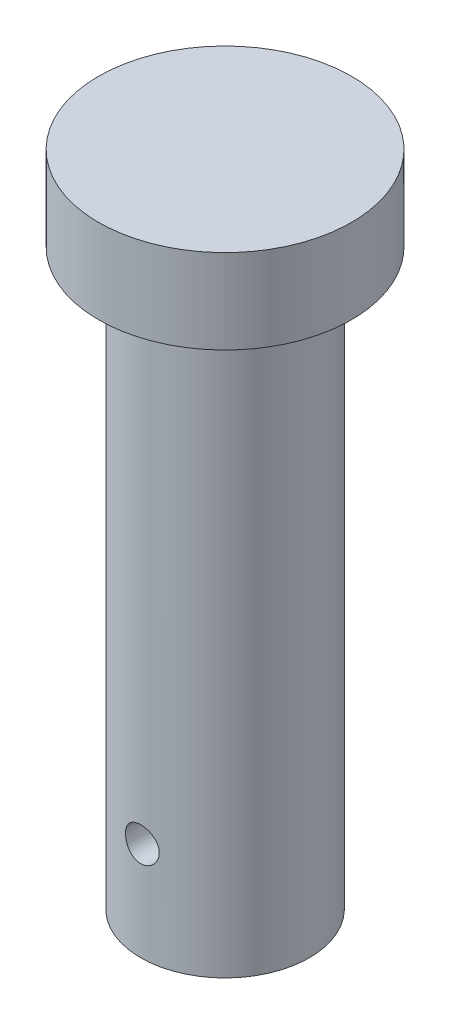
ISO-10303-21;
HEADER;
FILE_DESCRIPTION(('STEP AP214'),'2;1');
FILE_NAME('part.step','',(''),(''),'','','');
FILE_SCHEMA(('AUTOMOTIVE_DESIGN { 1 0 10303 214 1 1 1 1 }'));
ENDSEC;
DATA;
#1=APPLICATION_CONTEXT('core data for automotive mechanical design processes');
#2=APPLICATION_PROTOCOL_DEFINITION('international standard','automotive_design',2000,#1);
#3=PRODUCT_CONTEXT('',#1,'mechanical');
#4=PRODUCT('Part','Part','',(#3));
#5=PRODUCT_RELATED_PRODUCT_CATEGORY('part','',(#4));
#6=PRODUCT_DEFINITION_FORMATION('','',#4);
#7=PRODUCT_DEFINITION_CONTEXT('part definition',#1,'design');
#8=PRODUCT_DEFINITION('design','',#6,#7);
#9=PRODUCT_DEFINITION_SHAPE('','',#8);
#10=(LENGTH_UNIT() NAMED_UNIT(*) SI_UNIT(.MILLI.,.METRE.));
#11=(NAMED_UNIT(*) PLANE_ANGLE_UNIT() SI_UNIT($,.RADIAN.));
#12=(NAMED_UNIT(*) SI_UNIT($,.STERADIAN.) SOLID_ANGLE_UNIT());
#13=UNCERTAINTY_MEASURE_WITH_UNIT(LENGTH_MEASURE(1.E-05),#10,'distance_accuracy_value','');
#14=(GEOMETRIC_REPRESENTATION_CONTEXT(3) GLOBAL_UNCERTAINTY_ASSIGNED_CONTEXT((#13)) GLOBAL_UNIT_ASSIGNED_CONTEXT((#10,
#11,#12)) REPRESENTATION_CONTEXT('',''));
#15=CARTESIAN_POINT('',(0.,0.,0.));
#16=DIRECTION('',(0.,0.,1.));
#17=DIRECTION('',(1.,0.,0.));
#18=AXIS2_PLACEMENT_3D('',#15,#16,#17);
#19=CARTESIAN_POINT('',(0.,0.,0.));
#20=DIRECTION('',(0.,1.,0.));
#21=DIRECTION('',(-1.,0.,0.));
#22=AXIS2_PLACEMENT_3D('',#19,#20,#21);
#23=PLANE('',#22);
#24=CARTESIAN_POINT('',(0.,0.,0.));
#25=DIRECTION('',(0.,1.,0.));
#26=DIRECTION('',(-1.,0.,0.));
#27=AXIS2_PLACEMENT_3D('',#24,#25,#26);
#28=CIRCLE('',#27,15.);
#29=CARTESIAN_POINT('',(-15.,0.,0.));
#30=VERTEX_POINT('',#29);
#31=EDGE_CURVE('E10',#30,#30,#28,.T.);
#32=ORIENTED_EDGE('',*,*,#31,.F.);
#33=EDGE_LOOP('',(#32));
#34=FACE_BOUND('',#33,.T.);
#35=ADVANCED_FACE('F40',(#34),#23,.F.);
#36=CARTESIAN_POINT('',(0.,117.,0.));
#37=DIRECTION('',(0.,1.,0.));
#38=DIRECTION('',(-1.,0.,0.));
#39=AXIS2_PLACEMENT_3D('',#36,#37,#38);
#40=CYLINDRICAL_SURFACE('',#39,15.);
#41=CARTESIAN_POINT('',(3.,17.5,-14.6969384566991));
#42=CARTESIAN_POINT('',(2.99999383762581,17.6666931264735,-14.6969417707994));
#43=CARTESIAN_POINT('',(2.98605951515443,17.83346387,-14.6998052480611));
#44=CARTESIAN_POINT('',(2.93073685074852,18.1622875154294,-14.7109329391462));
#45=CARTESIAN_POINT('',(2.88932654121148,18.3243365339079,-14.7192014743436));
#46=CARTESIAN_POINT('',(2.78038734785924,18.6389119100626,-14.7401662116556));
#47=CARTESIAN_POINT('',(2.71288444245786,18.7914475645978,-14.7528580086323));
#48=CARTESIAN_POINT('',(2.55374732301151,19.0830245340909,-14.7812339844198));
#49=CARTESIAN_POINT('',(2.46211445580345,19.2220666016137,-14.7969179962038));
#50=CARTESIAN_POINT('',(2.25593722696031,19.4846830115616,-14.8297589908276));
#51=CARTESIAN_POINT('',(2.14111696773995,19.6080387636519,-14.8469321351174));
#52=CARTESIAN_POINT('',(1.89242036706393,19.8338726007369,-14.880674169078));
#53=CARTESIAN_POINT('',(1.75854269093395,19.9363492222516,-14.897243016325));
#54=CARTESIAN_POINT('',(1.47408406777277,20.1183640528854,-14.9280838925269));
#55=CARTESIAN_POINT('',(1.32336770301663,20.1976945414499,-14.9423346432465));
#56=CARTESIAN_POINT('',(1.01041245116181,20.3298248111444,-14.9667521065089));
#57=CARTESIAN_POINT('',(0.84817464426166,20.382627075703,-14.9769192013236));
#58=CARTESIAN_POINT('',(0.519050319835484,20.4595215808589,-14.9919096206526));
#59=CARTESIAN_POINT('',(0.352253217644443,20.483982932713,-14.9968015886438));
#60=CARTESIAN_POINT('',(0.0168557053126095,20.5046528555149,-15.0009276355081));
#61=CARTESIAN_POINT('',(-0.151744529495529,20.5008641489375,-15.0001622595828));
#62=CARTESIAN_POINT('',(-0.483426002230766,20.4654214593533,-14.9931130460555));
#63=CARTESIAN_POINT('',(-0.64655164289541,20.4341650684965,-14.9869079509751));
#64=CARTESIAN_POINT('',(-0.965194879740903,20.3453049026233,-14.9697653147823));
#65=CARTESIAN_POINT('',(-1.12071217124139,20.2877000734244,-14.9588275843212));
#66=CARTESIAN_POINT('',(-1.42085838960266,20.1474098795582,-14.9333188805988));
#67=CARTESIAN_POINT('',(-1.5654125224017,20.0645687466853,-14.9187254452567));
#68=CARTESIAN_POINT('',(-1.83871513757927,19.8762727682902,-14.8875140842136));
#69=CARTESIAN_POINT('',(-1.967461798575,19.7708153206885,-14.8708959256567));
#70=CARTESIAN_POINT('',(-2.20785429316037,19.5380991336746,-14.8371289309338));
#71=CARTESIAN_POINT('',(-2.31916294972089,19.4104924398112,-14.8199758937255));
#72=CARTESIAN_POINT('',(-2.51885547953042,19.1382506726477,-14.7873471479628));
#73=CARTESIAN_POINT('',(-2.60723891918325,18.9936152773504,-14.7718714711364));
#74=CARTESIAN_POINT('',(-2.75868844440565,18.6909375045346,-14.7443414241877));
#75=CARTESIAN_POINT('',(-2.82169994333313,18.532867097081,-14.7322944469065));
#76=CARTESIAN_POINT('',(-2.92017102488275,18.208086028828,-14.7130942896382));
#77=CARTESIAN_POINT('',(-2.95563419836993,18.0413764971427,-14.7059404718528));
#78=CARTESIAN_POINT('',(-2.99749801810815,17.7071054260029,-14.6974643780348));
#79=CARTESIAN_POINT('',(-3.00438557669373,17.539607277069,-14.6960444117146));
#80=CARTESIAN_POINT('',(-2.99021288493221,17.205855330401,-14.6989345706656));
#81=CARTESIAN_POINT('',(-2.96915421936733,17.0396014626434,-14.7032443710116));
#82=CARTESIAN_POINT('',(-2.90010662422247,16.7146940791233,-14.7170169748474));
#83=CARTESIAN_POINT('',(-2.8523778625179,16.5559829708927,-14.7264299704349));
#84=CARTESIAN_POINT('',(-2.73162310592555,16.2488101629138,-14.7493046805499));
#85=CARTESIAN_POINT('',(-2.65859502711953,16.1003493086928,-14.7627667285881));
#86=CARTESIAN_POINT('',(-2.48821242664679,15.8157606701495,-14.7924421788612));
#87=CARTESIAN_POINT('',(-2.39055323394826,15.6798188610975,-14.8086891559471));
#88=CARTESIAN_POINT('',(-2.17408671663814,15.4260750639973,-14.8420117147991));
#89=CARTESIAN_POINT('',(-2.05527721543361,15.3082749452522,-14.8590873817145));
#90=CARTESIAN_POINT('',(-1.79769682049367,15.0923123224433,-14.8924603760765));
#91=CARTESIAN_POINT('',(-1.65864749678889,14.99447903605,-14.9087417312605));
#92=CARTESIAN_POINT('',(-1.36580368990427,14.8235623555013,-14.9384138288586));
#93=CARTESIAN_POINT('',(-1.21200982630052,14.7504779219657,-14.9518046926563));
#94=CARTESIAN_POINT('',(-0.894908042472037,14.6316133847601,-14.974118821832));
#95=CARTESIAN_POINT('',(-0.731660020434234,14.5856784453212,-14.9830673742781));
#96=CARTESIAN_POINT('',(-0.399568364039735,14.5219262570085,-14.9955970781299));
#97=CARTESIAN_POINT('',(-0.230725406133635,14.504105621573,-14.9991788759955));
#98=CARTESIAN_POINT('',(0.104618681710863,14.4972190571113,-15.0005562136234));
#99=CARTESIAN_POINT('',(0.271109436424481,14.5076581586313,-14.9984513564799));
#100=CARTESIAN_POINT('',(0.599913093946949,14.5559018516435,-14.9889013068102));
#101=CARTESIAN_POINT('',(0.762226049261166,14.5937060990444,-14.9814561814329));
#102=CARTESIAN_POINT('',(1.07775824923519,14.6953869762748,-14.9620649509476));
#103=CARTESIAN_POINT('',(1.23099732972049,14.7592041343929,-14.9501291174284));
#104=CARTESIAN_POINT('',(1.52466366055821,14.9110367239933,-14.9230416637104));
#105=CARTESIAN_POINT('',(1.66508989730354,14.9990540677135,-14.9078897894096));
#106=CARTESIAN_POINT('',(1.93159167031775,15.1984581611839,-14.8757279747022));
#107=CARTESIAN_POINT('',(2.05739914834453,15.3101990091513,-14.858692002537));
#108=CARTESIAN_POINT('',(2.28864785327552,15.5531507202963,-14.8248366872359));
#109=CARTESIAN_POINT('',(2.39408424962674,15.6843661884398,-14.8080173963616));
#110=CARTESIAN_POINT('',(2.58267665834994,15.9642379500713,-14.7763002820179));
#111=CARTESIAN_POINT('',(2.66558044385427,16.1130668833638,-14.7614251071368));
#112=CARTESIAN_POINT('',(2.80507214779868,16.4227983197803,-14.7355571137924));
#113=CARTESIAN_POINT('',(2.86168393792249,16.5836897160616,-14.7245607757495));
#114=CARTESIAN_POINT('',(2.93600741957297,16.8707873663286,-14.7098904341354));
#115=CARTESIAN_POINT('',(2.95996169557105,16.9953562585419,-14.7050635474382));
#116=CARTESIAN_POINT('',(2.99196005387913,17.2466018636534,-14.6985863537725));
#117=CARTESIAN_POINT('',(3.00000468468793,17.3732785037334,-14.6969359372925));
#118=CARTESIAN_POINT('',(3.,17.5,-14.6969384566991));
#119=B_SPLINE_CURVE_WITH_KNOTS('',3,(#41,#42,#43,#44,#45,#46,#47,#48,#49,#50,#51,#52,#53,#54,
#55,#56,#57,#58,#59,#60,#61,#62,#63,#64,#65,#66,#67,#68,#69,#70,#71,#72,#73,#74,#75,#76,#77,#78,
#79,#80,#81,#82,#83,#84,#85,#86,#87,#88,#89,#90,#91,#92,#93,#94,#95,#96,#97,#98,#99,#100,#101,
#102,#103,#104,#105,#106,#107,#108,#109,#110,#111,#112,#113,#114,#115,#116,#117,#118),
.UNSPECIFIED.,.T.,.F.,(4,2,2,2,2,2,2,2,2,2,2,2,2,2,2,2,2,2,2,2,2,2,2,2,2,2,2,2,2,2,2,2,2,2,2,2,
2,2,4),(0.,0.499615391608287,0.999630717852891,1.49914949382176,1.99864039457959,
2.5044675764531,3.01033020106266,3.52060201312351,4.03082604739679,4.53432746649241,
5.03778036348745,5.53406368900612,6.03036687221251,6.5297977266691,7.02928607310198,
7.5374804028745,8.04568434368161,8.5549758951833,9.06420105048074,9.56471273413781,
10.0651960358526,10.5608802534996,11.0566053106319,11.5587917932356,12.0610299861063,
12.5709780520035,13.0809046989031,13.5878944073595,14.0948230407488,14.5929305224406,
15.0910317410027,15.5880005122636,16.0850085640405,16.5900345607679,17.0951801666934,
17.6057669573882,18.1158892527059,18.4957141091448,18.8755258705644),.UNSPECIFIED.);
#120=CARTESIAN_POINT('',(3.,17.5,-14.6969384566991));
#121=VERTEX_POINT('',#120);
#122=EDGE_CURVE('E37',#121,#121,#119,.T.);
#123=ORIENTED_EDGE('',*,*,#122,.T.);
#124=EDGE_LOOP('',(#123));
#125=FACE_BOUND('',#124,.T.);
#126=CARTESIAN_POINT('',(3.,17.5,14.6969384566991));
#127=CARTESIAN_POINT('',(2.99999383762581,17.3333068735265,14.6969417707994));
#128=CARTESIAN_POINT('',(2.98605951515443,17.16653613,14.6998052480611));
#129=CARTESIAN_POINT('',(2.93073685074852,16.8377124845706,14.7109329391462));
#130=CARTESIAN_POINT('',(2.88932654121148,16.6756634660921,14.7192014743436));
#131=CARTESIAN_POINT('',(2.78038734785924,16.3610880899374,14.7401662116556));
#132=CARTESIAN_POINT('',(2.71288444245786,16.2085524354022,14.7528580086323));
#133=CARTESIAN_POINT('',(2.55374732301152,15.9169754659091,14.7812339844198));
#134=CARTESIAN_POINT('',(2.46211445580345,15.7779333983863,14.7969179962038));
#135=CARTESIAN_POINT('',(2.25593722696031,15.5153169884384,14.8297589908276));
#136=CARTESIAN_POINT('',(2.14111696773996,15.3919612363481,14.8469321351174));
#137=CARTESIAN_POINT('',(1.89242036706393,15.1661273992631,14.880674169078));
#138=CARTESIAN_POINT('',(1.75854269093396,15.0636507777484,14.8972430163249));
#139=CARTESIAN_POINT('',(1.47408406777277,14.8816359471146,14.9280838925269));
#140=CARTESIAN_POINT('',(1.32336770301664,14.8023054585501,14.9423346432465));
#141=CARTESIAN_POINT('',(1.01041245116182,14.6701751888556,14.9667521065089));
#142=CARTESIAN_POINT('',(0.848174644261664,14.617372924297,14.9769192013236));
#143=CARTESIAN_POINT('',(0.519050319835488,14.5404784191411,14.9919096206526));
#144=CARTESIAN_POINT('',(0.352253217644447,14.516017067287,14.9968015886438));
#145=CARTESIAN_POINT('',(0.0168557053126141,14.4953471444851,15.0009276355081));
#146=CARTESIAN_POINT('',(-0.151744529495524,14.4991358510625,15.0001622595828));
#147=CARTESIAN_POINT('',(-0.483426002230761,14.5345785406467,14.9931130460555));
#148=CARTESIAN_POINT('',(-0.646551642895406,14.5658349315035,14.9869079509751));
#149=CARTESIAN_POINT('',(-0.9651948797409,14.6546950973767,14.9697653147823));
#150=CARTESIAN_POINT('',(-1.12071217124138,14.7122999265756,14.9588275843212));
#151=CARTESIAN_POINT('',(-1.42085838960266,14.8525901204418,14.9333188805988));
#152=CARTESIAN_POINT('',(-1.5654125224017,14.9354312533147,14.9187254452567));
#153=CARTESIAN_POINT('',(-1.83871513757926,15.1237272317098,14.8875140842136));
#154=CARTESIAN_POINT('',(-1.967461798575,15.2291846793115,14.8708959256567));
#155=CARTESIAN_POINT('',(-2.20785429316037,15.4619008663254,14.8371289309338));
#156=CARTESIAN_POINT('',(-2.31916294972089,15.5895075601888,14.8199758937255));
#157=CARTESIAN_POINT('',(-2.51885547953042,15.8617493273523,14.7873471479628));
#158=CARTESIAN_POINT('',(-2.60723891918325,16.0063847226496,14.7718714711364));
#159=CARTESIAN_POINT('',(-2.75868844440564,16.3090624954654,14.7443414241877));
#160=CARTESIAN_POINT('',(-2.82169994333313,16.467132902919,14.7322944469065));
#161=CARTESIAN_POINT('',(-2.92017102488275,16.791913971172,14.7130942896382));
#162=CARTESIAN_POINT('',(-2.95563419836993,16.9586235028573,14.7059404718528));
#163=CARTESIAN_POINT('',(-2.99749801810815,17.2928945739971,14.6974643780348));
#164=CARTESIAN_POINT('',(-3.00438557669374,17.460392722931,14.6960444117146));
#165=CARTESIAN_POINT('',(-2.99021288493222,17.794144669599,14.6989345706656));
#166=CARTESIAN_POINT('',(-2.96915421936733,17.9603985373566,14.7032443710116));
#167=CARTESIAN_POINT('',(-2.90010662422247,18.2853059208767,14.7170169748474));
#168=CARTESIAN_POINT('',(-2.8523778625179,18.4440170291073,14.7264299704349));
#169=CARTESIAN_POINT('',(-2.73162310592555,18.7511898370862,14.7493046805499));
#170=CARTESIAN_POINT('',(-2.65859502711953,18.8996506913072,14.7627667285881));
#171=CARTESIAN_POINT('',(-2.4882124266468,19.1842393298505,14.7924421788612));
#172=CARTESIAN_POINT('',(-2.39055323394827,19.3201811389025,14.8086891559471));
#173=CARTESIAN_POINT('',(-2.17408671663814,19.5739249360027,14.8420117147991));
#174=CARTESIAN_POINT('',(-2.05527721543362,19.6917250547478,14.8590873817145));
#175=CARTESIAN_POINT('',(-1.79769682049368,19.9076876775567,14.8924603760765));
#176=CARTESIAN_POINT('',(-1.6586474967889,20.00552096395,14.9087417312605));
#177=CARTESIAN_POINT('',(-1.36580368990427,20.1764376444987,14.9384138288586));
#178=CARTESIAN_POINT('',(-1.21200982630053,20.2495220780343,14.9518046926563));
#179=CARTESIAN_POINT('',(-0.894908042472044,20.3683866152399,14.974118821832));
#180=CARTESIAN_POINT('',(-0.731660020434241,20.4143215546788,14.9830673742781));
#181=CARTESIAN_POINT('',(-0.399568364039741,20.4780737429915,14.9955970781298));
#182=CARTESIAN_POINT('',(-0.230725406133641,20.495894378427,14.9991788759955));
#183=CARTESIAN_POINT('',(0.104618681710858,20.5027809428887,15.0005562136234));
#184=CARTESIAN_POINT('',(0.271109436424476,20.4923418413687,14.9984513564799));
#185=CARTESIAN_POINT('',(0.599913093946944,20.4440981483565,14.9889013068102));
#186=CARTESIAN_POINT('',(0.762226049261162,20.4062939009556,14.9814561814329));
#187=CARTESIAN_POINT('',(1.07775824923519,20.3046130237252,14.9620649509476));
#188=CARTESIAN_POINT('',(1.23099732972049,20.2407958656071,14.9501291174284));
#189=CARTESIAN_POINT('',(1.5246636605582,20.0889632760067,14.9230416637104));
#190=CARTESIAN_POINT('',(1.66508989730353,20.0009459322865,14.9078897894096));
#191=CARTESIAN_POINT('',(1.93159167031774,19.8015418388162,14.8757279747022));
#192=CARTESIAN_POINT('',(2.05739914834452,19.6898009908487,14.858692002537));
#193=CARTESIAN_POINT('',(2.28864785327552,19.4468492797037,14.824836687236));
#194=CARTESIAN_POINT('',(2.39408424962674,19.3156338115602,14.8080173963616));
#195=CARTESIAN_POINT('',(2.58267665834994,19.0357620499287,14.7763002820179));
#196=CARTESIAN_POINT('',(2.66558044385427,18.8869331166362,14.7614251071368));
#197=CARTESIAN_POINT('',(2.80507214779868,18.5772016802197,14.7355571137924));
#198=CARTESIAN_POINT('',(2.86168393792249,18.4163102839384,14.7245607757495));
#199=CARTESIAN_POINT('',(2.93600741957297,18.1292126336714,14.7098904341354));
#200=CARTESIAN_POINT('',(2.95996169557105,18.0046437414581,14.7050635474382));
#201=CARTESIAN_POINT('',(2.99196005387913,17.7533981363466,14.6985863537725));
#202=CARTESIAN_POINT('',(3.00000468468793,17.6267214962666,14.6969359372925));
#203=CARTESIAN_POINT('',(3.,17.5,14.6969384566991));
#204=B_SPLINE_CURVE_WITH_KNOTS('',3,(#126,#127,#128,#129,#130,#131,#132,#133,#134,#135,#136,
#137,#138,#139,#140,#141,#142,#143,#144,#145,#146,#147,#148,#149,#150,#151,#152,#153,#154,#155,
#156,#157,#158,#159,#160,#161,#162,#163,#164,#165,#166,#167,#168,#169,#170,#171,#172,#173,#174,
#175,#176,#177,#178,#179,#180,#181,#182,#183,#184,#185,#186,#187,#188,#189,#190,#191,#192,#193,
#194,#195,#196,#197,#198,#199,#200,#201,#202,#203),.UNSPECIFIED.,.T.,.F.,(4,2,2,2,2,2,2,2,2,2,2,
2,2,2,2,2,2,2,2,2,2,2,2,2,2,2,2,2,2,2,2,2,2,2,2,2,2,2,4),(0.,0.49961539160828,0.999630717852887,
1.49914949382176,1.99864039457959,2.5044675764531,3.01033020106265,3.5206020131235,
4.03082604739679,4.53432746649241,5.03778036348744,5.53406368900612,6.0303668722125,
6.52979772666909,7.02928607310198,7.5374804028745,8.04568434368161,8.5549758951833,
9.06420105048074,9.5647127341378,10.0651960358526,10.5608802534996,11.0566053106319,
11.5587917932356,12.0610299861063,12.5709780520035,13.0809046989031,13.5878944073595,
14.0948230407488,14.5929305224406,15.0910317410027,15.5880005122635,16.0850085640405,
16.5900345607679,17.0951801666934,17.6057669573882,18.1158892527059,18.4957141091448,
18.8755258705644),.UNSPECIFIED.);
#205=CARTESIAN_POINT('',(3.,17.5,14.6969384566991));
#206=VERTEX_POINT('',#205);
#207=EDGE_CURVE('E57',#206,#206,#204,.T.);
#208=ORIENTED_EDGE('',*,*,#207,.T.);
#209=EDGE_LOOP('',(#208));
#210=FACE_BOUND('',#209,.T.);
#211=CARTESIAN_POINT('',(0.,102.,0.));
#212=DIRECTION('',(0.,1.,0.));
#213=DIRECTION('',(-1.,0.,0.));
#214=AXIS2_PLACEMENT_3D('',#211,#212,#213);
#215=CIRCLE('',#214,15.);
#216=CARTESIAN_POINT('',(-15.,102.,0.));
#217=VERTEX_POINT('',#216);
#218=EDGE_CURVE('E48',#217,#217,#215,.T.);
#219=ORIENTED_EDGE('',*,*,#218,.F.);
#220=EDGE_LOOP('',(#219));
#221=FACE_BOUND('',#220,.T.);
#222=ORIENTED_EDGE('',*,*,#31,.T.);
#223=EDGE_LOOP('',(#222));
#224=FACE_BOUND('',#223,.T.);
#225=ADVANCED_FACE('F63',(#125,#210,#221,#224),#40,.T.);
#226=CARTESIAN_POINT('',(15.,102.,0.));
#227=DIRECTION('',(0.,1.,0.));
#228=DIRECTION('',(-1.,0.,0.));
#229=AXIS2_PLACEMENT_3D('',#226,#227,#228);
#230=PLANE('',#229);
#231=CARTESIAN_POINT('',(0.,102.,0.));
#232=DIRECTION('',(0.,1.,0.));
#233=DIRECTION('',(-1.,0.,0.));
#234=AXIS2_PLACEMENT_3D('',#231,#232,#233);
#235=CIRCLE('',#234,22.5);
#236=CARTESIAN_POINT('',(-22.5,102.,0.));
#237=VERTEX_POINT('',#236);
#238=EDGE_CURVE('E52',#237,#237,#235,.T.);
#239=ORIENTED_EDGE('',*,*,#238,.F.);
#240=EDGE_LOOP('',(#239));
#241=FACE_BOUND('',#240,.T.);
#242=ORIENTED_EDGE('',*,*,#218,.T.);
#243=EDGE_LOOP('',(#242));
#244=FACE_BOUND('',#243,.T.);
#245=ADVANCED_FACE('F78',(#241,#244),#230,.F.);
#246=CARTESIAN_POINT('',(0.,117.,0.));
#247=DIRECTION('',(0.,1.,0.));
#248=DIRECTION('',(-1.,0.,0.));
#249=AXIS2_PLACEMENT_3D('',#246,#247,#248);
#250=CYLINDRICAL_SURFACE('',#249,22.5);
#251=CARTESIAN_POINT('',(0.,117.,0.));
#252=DIRECTION('',(0.,1.,0.));
#253=DIRECTION('',(-1.,0.,0.));
#254=AXIS2_PLACEMENT_3D('',#251,#252,#253);
#255=CIRCLE('',#254,22.5);
#256=CARTESIAN_POINT('',(-22.5,117.,0.));
#257=VERTEX_POINT('',#256);
#258=EDGE_CURVE('E128',#257,#257,#255,.T.);
#259=ORIENTED_EDGE('',*,*,#258,.F.);
#260=EDGE_LOOP('',(#259));
#261=FACE_BOUND('',#260,.T.);
#262=ORIENTED_EDGE('',*,*,#238,.T.);
#263=EDGE_LOOP('',(#262));
#264=FACE_BOUND('',#263,.T.);
#265=ADVANCED_FACE('F71',(#261,#264),#250,.T.);
#266=CARTESIAN_POINT('',(22.5,117.,0.));
#267=DIRECTION('',(0.,-1.,0.));
#268=DIRECTION('',(1.,0.,0.));
#269=AXIS2_PLACEMENT_3D('',#266,#267,#268);
#270=PLANE('',#269);
#271=ORIENTED_EDGE('',*,*,#258,.T.);
#272=EDGE_LOOP('',(#271));
#273=FACE_BOUND('',#272,.T.);
#274=ADVANCED_FACE('F66',(#273),#270,.F.);
#275=CARTESIAN_POINT('',(0.,17.5,-22.5));
#276=DIRECTION('',(0.,0.,1.));
#277=DIRECTION('',(1.,0.,0.));
#278=AXIS2_PLACEMENT_3D('',#275,#276,#277);
#279=CYLINDRICAL_SURFACE('',#278,3.);
#280=ORIENTED_EDGE('',*,*,#207,.F.);
#281=EDGE_LOOP('',(#280));
#282=FACE_BOUND('',#281,.T.);
#283=ORIENTED_EDGE('',*,*,#122,.F.);
#284=EDGE_LOOP('',(#283));
#285=FACE_BOUND('',#284,.T.);
#286=ADVANCED_FACE('F62',(#282,#285),#279,.F.);
#287=CLOSED_SHELL('',(#35,#225,#245,#265,#274,#286));
#288=MANIFOLD_SOLID_BREP('B2',#287);
#289=ADVANCED_BREP_SHAPE_REPRESENTATION('',(#18,#288),#14);
#290=SHAPE_DEFINITION_REPRESENTATION(#9,#289);
ENDSEC;
END-ISO-10303-21;
